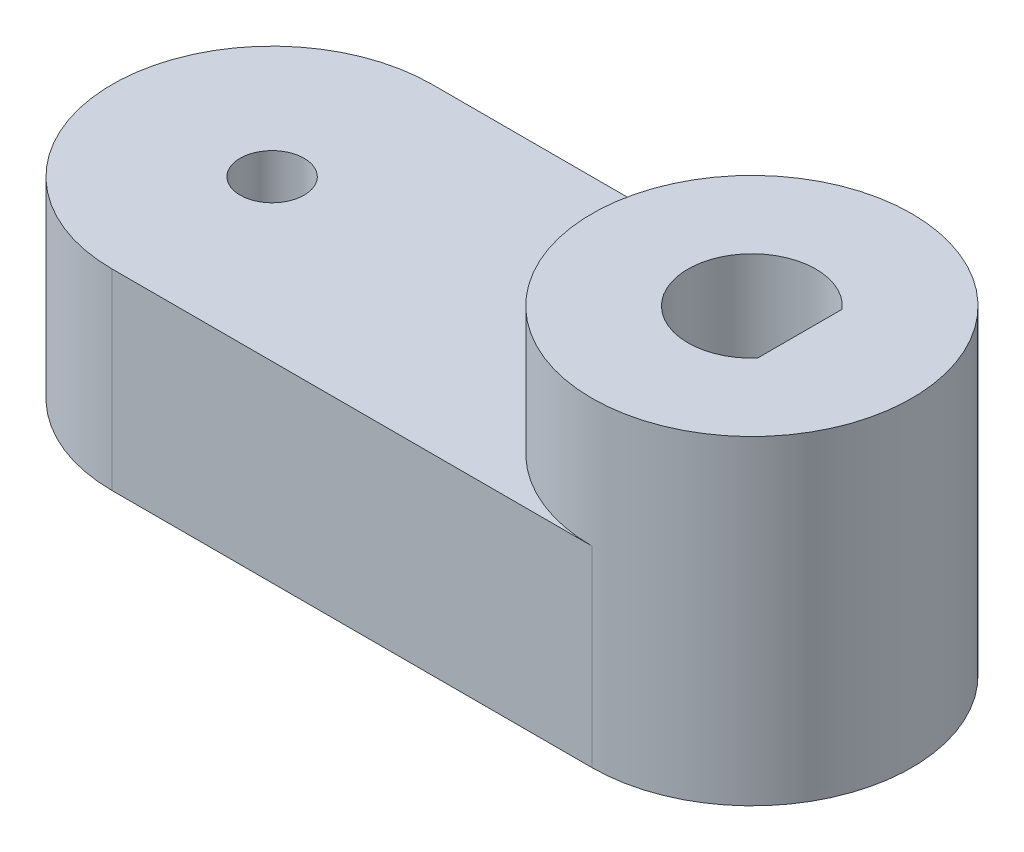
ISO-10303-21;
HEADER;
FILE_DESCRIPTION(('STEP AP214'),'2;1');
FILE_NAME('part.step','',(''),(''),'','','');
FILE_SCHEMA(('AUTOMOTIVE_DESIGN { 1 0 10303 214 1 1 1 1 }'));
ENDSEC;
DATA;
#1=APPLICATION_CONTEXT('core data for automotive mechanical design processes');
#2=APPLICATION_PROTOCOL_DEFINITION('international standard','automotive_design',2000,#1);
#3=PRODUCT_CONTEXT('',#1,'mechanical');
#4=PRODUCT('Part','Part','',(#3));
#5=PRODUCT_RELATED_PRODUCT_CATEGORY('part','',(#4));
#6=PRODUCT_DEFINITION_FORMATION('','',#4);
#7=PRODUCT_DEFINITION_CONTEXT('part definition',#1,'design');
#8=PRODUCT_DEFINITION('design','',#6,#7);
#9=PRODUCT_DEFINITION_SHAPE('','',#8);
#10=(LENGTH_UNIT() NAMED_UNIT(*) SI_UNIT(.MILLI.,.METRE.));
#11=(NAMED_UNIT(*) PLANE_ANGLE_UNIT() SI_UNIT($,.RADIAN.));
#12=(NAMED_UNIT(*) SI_UNIT($,.STERADIAN.) SOLID_ANGLE_UNIT());
#13=UNCERTAINTY_MEASURE_WITH_UNIT(LENGTH_MEASURE(1.E-05),#10,'distance_accuracy_value','');
#14=(GEOMETRIC_REPRESENTATION_CONTEXT(3) GLOBAL_UNCERTAINTY_ASSIGNED_CONTEXT((#13)) GLOBAL_UNIT_ASSIGNED_CONTEXT((#10,
#11,#12)) REPRESENTATION_CONTEXT('',''));
#15=CARTESIAN_POINT('',(0.,0.,0.));
#16=DIRECTION('',(0.,0.,1.));
#17=DIRECTION('',(1.,0.,0.));
#18=AXIS2_PLACEMENT_3D('',#15,#16,#17);
#19=CARTESIAN_POINT('',(0.,6.,0.));
#20=DIRECTION('',(0.,1.,0.));
#21=DIRECTION('',(0.,0.,1.));
#22=AXIS2_PLACEMENT_3D('',#19,#20,#21);
#23=PLANE('',#22);
#24=CARTESIAN_POINT('',(15.,6.,0.));
#25=DIRECTION('',(0.,1.,0.));
#26=DIRECTION('',(0.,0.,1.));
#27=AXIS2_PLACEMENT_3D('',#24,#25,#26);
#28=CIRCLE('',#27,5.00000000000002);
#29=CARTESIAN_POINT('',(15.,6.,-5.));
#30=VERTEX_POINT('',#29);
#31=CARTESIAN_POINT('',(15.,6.,5.00000000000006));
#32=VERTEX_POINT('',#31);
#33=EDGE_CURVE('E11',#30,#32,#28,.T.);
#34=ORIENTED_EDGE('',*,*,#33,.F.);
#35=DIRECTION('',(-1.,0.,0.));
#36=VECTOR('',#35,1.);
#37=CARTESIAN_POINT('',(0.,6.,-5.));
#38=LINE('',#37,#36);
#39=CARTESIAN_POINT('',(0.,6.,-5.));
#40=VERTEX_POINT('',#39);
#41=EDGE_CURVE('E121',#30,#40,#38,.T.);
#42=ORIENTED_EDGE('',*,*,#41,.T.);
#43=CARTESIAN_POINT('',(0.,6.,0.));
#44=DIRECTION('',(0.,1.,0.));
#45=DIRECTION('',(0.,0.,1.));
#46=AXIS2_PLACEMENT_3D('',#43,#44,#45);
#47=CIRCLE('',#46,5.);
#48=CARTESIAN_POINT('',(0.,6.,5.));
#49=VERTEX_POINT('',#48);
#50=EDGE_CURVE('E114',#40,#49,#47,.T.);
#51=ORIENTED_EDGE('',*,*,#50,.T.);
#52=DIRECTION('',(1.,0.,0.));
#53=VECTOR('',#52,1.);
#54=CARTESIAN_POINT('',(0.,6.,5.));
#55=LINE('',#54,#53);
#56=EDGE_CURVE('E117',#49,#32,#55,.T.);
#57=ORIENTED_EDGE('',*,*,#56,.T.);
#58=EDGE_LOOP('',(#34,#42,#51,#57));
#59=FACE_BOUND('',#58,.T.);
#60=CARTESIAN_POINT('',(0.,6.,0.));
#61=DIRECTION('',(0.,1.,0.));
#62=DIRECTION('',(0.,0.,1.));
#63=AXIS2_PLACEMENT_3D('',#60,#61,#62);
#64=CIRCLE('',#63,1.);
#65=CARTESIAN_POINT('',(0.,6.,1.));
#66=VERTEX_POINT('',#65);
#67=EDGE_CURVE('E108',#66,#66,#64,.T.);
#68=ORIENTED_EDGE('',*,*,#67,.F.);
#69=EDGE_LOOP('',(#68));
#70=FACE_BOUND('',#69,.T.);
#71=ADVANCED_FACE('F33',(#59,#70),#23,.T.);
#72=CARTESIAN_POINT('',(0.,0.,0.));
#73=DIRECTION('',(0.,1.,0.));
#74=DIRECTION('',(0.,0.,1.));
#75=AXIS2_PLACEMENT_3D('',#72,#73,#74);
#76=PLANE('',#75);
#77=DIRECTION('',(0.,0.,-1.));
#78=VECTOR('',#77,1.);
#79=CARTESIAN_POINT('',(16.5,0.,1.32287565553233));
#80=LINE('',#79,#78);
#81=CARTESIAN_POINT('',(16.5,0.,1.32287565553233));
#82=VERTEX_POINT('',#81);
#83=CARTESIAN_POINT('',(16.5,0.,-1.32287565553233));
#84=VERTEX_POINT('',#83);
#85=EDGE_CURVE('E90',#82,#84,#80,.T.);
#86=ORIENTED_EDGE('',*,*,#85,.T.);
#87=CARTESIAN_POINT('',(15.,0.,0.));
#88=DIRECTION('',(0.,1.,0.));
#89=DIRECTION('',(0.,0.,1.));
#90=AXIS2_PLACEMENT_3D('',#87,#88,#89);
#91=CIRCLE('',#90,2.00000000000003);
#92=EDGE_CURVE('E49',#84,#82,#91,.T.);
#93=ORIENTED_EDGE('',*,*,#92,.T.);
#94=EDGE_LOOP('',(#86,#93));
#95=FACE_BOUND('',#94,.T.);
#96=CARTESIAN_POINT('',(0.,0.,0.));
#97=DIRECTION('',(0.,1.,0.));
#98=DIRECTION('',(0.,0.,1.));
#99=AXIS2_PLACEMENT_3D('',#96,#97,#98);
#100=CIRCLE('',#99,5.);
#101=CARTESIAN_POINT('',(0.,0.,-5.));
#102=VERTEX_POINT('',#101);
#103=CARTESIAN_POINT('',(0.,0.,5.));
#104=VERTEX_POINT('',#103);
#105=EDGE_CURVE('E111',#102,#104,#100,.T.);
#106=ORIENTED_EDGE('',*,*,#105,.F.);
#107=DIRECTION('',(-1.,0.,0.));
#108=VECTOR('',#107,1.);
#109=CARTESIAN_POINT('',(0.,0.,-5.));
#110=LINE('',#109,#108);
#111=CARTESIAN_POINT('',(15.,0.,-5.));
#112=VERTEX_POINT('',#111);
#113=EDGE_CURVE('E118',#112,#102,#110,.T.);
#114=ORIENTED_EDGE('',*,*,#113,.F.);
#115=CARTESIAN_POINT('',(15.,0.,0.));
#116=DIRECTION('',(0.,1.,0.));
#117=DIRECTION('',(0.,0.,-1.));
#118=AXIS2_PLACEMENT_3D('',#115,#116,#117);
#119=CIRCLE('',#118,5.);
#120=CARTESIAN_POINT('',(15.,0.,5.00000000000004));
#121=VERTEX_POINT('',#120);
#122=EDGE_CURVE('E128',#121,#112,#119,.T.);
#123=ORIENTED_EDGE('',*,*,#122,.F.);
#124=DIRECTION('',(1.,0.,0.));
#125=VECTOR('',#124,1.);
#126=CARTESIAN_POINT('',(0.,0.,5.));
#127=LINE('',#126,#125);
#128=EDGE_CURVE('E126',#104,#121,#127,.T.);
#129=ORIENTED_EDGE('',*,*,#128,.F.);
#130=EDGE_LOOP('',(#106,#114,#123,#129));
#131=FACE_BOUND('',#130,.T.);
#132=CARTESIAN_POINT('',(0.,0.,0.));
#133=DIRECTION('',(0.,1.,0.));
#134=DIRECTION('',(0.,0.,1.));
#135=AXIS2_PLACEMENT_3D('',#132,#133,#134);
#136=CIRCLE('',#135,1.);
#137=CARTESIAN_POINT('',(0.,0.,1.));
#138=VERTEX_POINT('',#137);
#139=EDGE_CURVE('E106',#138,#138,#136,.T.);
#140=ORIENTED_EDGE('',*,*,#139,.T.);
#141=EDGE_LOOP('',(#140));
#142=FACE_BOUND('',#141,.T.);
#143=ADVANCED_FACE('F96',(#95,#131,#142),#76,.F.);
#144=CARTESIAN_POINT('',(0.,6.,0.));
#145=DIRECTION('',(0.,-1.,0.));
#146=DIRECTION('',(0.,0.,-1.));
#147=AXIS2_PLACEMENT_3D('',#144,#145,#146);
#148=CYLINDRICAL_SURFACE('',#147,5.);
#149=ORIENTED_EDGE('',*,*,#105,.T.);
#150=DIRECTION('',(0.,-1.,0.));
#151=VECTOR('',#150,1.);
#152=CARTESIAN_POINT('',(0.,6.,5.));
#153=LINE('',#152,#151);
#154=EDGE_CURVE('E37',#49,#104,#153,.T.);
#155=ORIENTED_EDGE('',*,*,#154,.F.);
#156=ORIENTED_EDGE('',*,*,#50,.F.);
#157=DIRECTION('',(0.,-1.,0.));
#158=VECTOR('',#157,1.);
#159=CARTESIAN_POINT('',(0.,6.,-5.));
#160=LINE('',#159,#158);
#161=EDGE_CURVE('E123',#40,#102,#160,.T.);
#162=ORIENTED_EDGE('',*,*,#161,.T.);
#163=EDGE_LOOP('',(#149,#155,#156,#162));
#164=FACE_BOUND('',#163,.T.);
#165=ADVANCED_FACE('F35',(#164),#148,.T.);
#166=CARTESIAN_POINT('',(0.,6.,5.));
#167=DIRECTION('',(0.,0.,-1.));
#168=DIRECTION('',(-1.,0.,0.));
#169=AXIS2_PLACEMENT_3D('',#166,#167,#168);
#170=PLANE('',#169);
#171=ORIENTED_EDGE('',*,*,#128,.T.);
#172=DIRECTION('',(0.,-1.,0.));
#173=VECTOR('',#172,1.);
#174=CARTESIAN_POINT('',(15.,6.,5.00000000000004));
#175=LINE('',#174,#173);
#176=EDGE_CURVE('E135',#32,#121,#175,.T.);
#177=ORIENTED_EDGE('',*,*,#176,.F.);
#178=ORIENTED_EDGE('',*,*,#56,.F.);
#179=ORIENTED_EDGE('',*,*,#154,.T.);
#180=EDGE_LOOP('',(#171,#177,#178,#179));
#181=FACE_BOUND('',#180,.T.);
#182=ADVANCED_FACE('F142',(#181),#170,.F.);
#183=CARTESIAN_POINT('',(15.,6.,0.));
#184=DIRECTION('',(0.,-1.,0.));
#185=DIRECTION('',(0.,0.,-1.));
#186=AXIS2_PLACEMENT_3D('',#183,#184,#185);
#187=CYLINDRICAL_SURFACE('',#186,5.);
#188=ORIENTED_EDGE('',*,*,#122,.T.);
#189=DIRECTION('',(0.,-1.,0.));
#190=VECTOR('',#189,1.);
#191=CARTESIAN_POINT('',(15.,6.,-5.));
#192=LINE('',#191,#190);
#193=EDGE_CURVE('E133',#30,#112,#192,.T.);
#194=ORIENTED_EDGE('',*,*,#193,.F.);
#195=ORIENTED_EDGE('',*,*,#33,.T.);
#196=ORIENTED_EDGE('',*,*,#176,.T.);
#197=EDGE_LOOP('',(#188,#194,#195,#196));
#198=FACE_BOUND('',#197,.T.);
#199=CARTESIAN_POINT('',(15.,10.,0.));
#200=DIRECTION('',(0.,1.,0.));
#201=DIRECTION('',(0.,0.,1.));
#202=AXIS2_PLACEMENT_3D('',#199,#200,#201);
#203=CIRCLE('',#202,5.00000000000002);
#204=CARTESIAN_POINT('',(15.,10.,5.00000000000006));
#205=VERTEX_POINT('',#204);
#206=EDGE_CURVE('E103',#205,#205,#203,.T.);
#207=ORIENTED_EDGE('',*,*,#206,.F.);
#208=EDGE_LOOP('',(#207));
#209=FACE_BOUND('',#208,.T.);
#210=ADVANCED_FACE('F150',(#198,#209),#187,.T.);
#211=CARTESIAN_POINT('',(0.,6.,-5.));
#212=DIRECTION('',(0.,0.,1.));
#213=DIRECTION('',(1.,0.,0.));
#214=AXIS2_PLACEMENT_3D('',#211,#212,#213);
#215=PLANE('',#214);
#216=ORIENTED_EDGE('',*,*,#113,.T.);
#217=ORIENTED_EDGE('',*,*,#161,.F.);
#218=ORIENTED_EDGE('',*,*,#41,.F.);
#219=ORIENTED_EDGE('',*,*,#193,.T.);
#220=EDGE_LOOP('',(#216,#217,#218,#219));
#221=FACE_BOUND('',#220,.T.);
#222=ADVANCED_FACE('F154',(#221),#215,.F.);
#223=CARTESIAN_POINT('',(0.,6.,0.));
#224=DIRECTION('',(0.,-1.,0.));
#225=DIRECTION('',(0.,0.,-1.));
#226=AXIS2_PLACEMENT_3D('',#223,#224,#225);
#227=CYLINDRICAL_SURFACE('',#226,1.);
#228=ORIENTED_EDGE('',*,*,#67,.T.);
#229=EDGE_LOOP('',(#228));
#230=FACE_BOUND('',#229,.T.);
#231=ORIENTED_EDGE('',*,*,#139,.F.);
#232=EDGE_LOOP('',(#231));
#233=FACE_BOUND('',#232,.T.);
#234=ADVANCED_FACE('F161',(#230,#233),#227,.F.);
#235=CARTESIAN_POINT('',(15.,10.,0.));
#236=DIRECTION('',(0.,1.,0.));
#237=DIRECTION('',(0.,0.,1.));
#238=AXIS2_PLACEMENT_3D('',#235,#236,#237);
#239=PLANE('',#238);
#240=CARTESIAN_POINT('',(15.,10.,0.));
#241=DIRECTION('',(0.,1.,0.));
#242=DIRECTION('',(0.,0.,1.));
#243=AXIS2_PLACEMENT_3D('',#240,#241,#242);
#244=CIRCLE('',#243,2.00000000000003);
#245=CARTESIAN_POINT('',(16.5,10.,-1.32287565553233));
#246=VERTEX_POINT('',#245);
#247=CARTESIAN_POINT('',(16.5,10.,1.32287565553233));
#248=VERTEX_POINT('',#247);
#249=EDGE_CURVE('E54',#246,#248,#244,.T.);
#250=ORIENTED_EDGE('',*,*,#249,.F.);
#251=DIRECTION('',(0.,0.,-1.));
#252=VECTOR('',#251,1.);
#253=CARTESIAN_POINT('',(16.5,10.,1.32287565553233));
#254=LINE('',#253,#252);
#255=EDGE_CURVE('E98',#248,#246,#254,.T.);
#256=ORIENTED_EDGE('',*,*,#255,.F.);
#257=EDGE_LOOP('',(#250,#256));
#258=FACE_BOUND('',#257,.T.);
#259=ORIENTED_EDGE('',*,*,#206,.T.);
#260=EDGE_LOOP('',(#259));
#261=FACE_BOUND('',#260,.T.);
#262=ADVANCED_FACE('F164',(#258,#261),#239,.T.);
#263=CARTESIAN_POINT('',(15.,0.,0.));
#264=DIRECTION('',(0.,1.,0.));
#265=DIRECTION('',(0.,0.,1.));
#266=AXIS2_PLACEMENT_3D('',#263,#264,#265);
#267=CYLINDRICAL_SURFACE('',#266,2.00000000000003);
#268=ORIENTED_EDGE('',*,*,#249,.T.);
#269=DIRECTION('',(0.,1.,0.));
#270=VECTOR('',#269,1.);
#271=CARTESIAN_POINT('',(16.5,0.,1.32287565553233));
#272=LINE('',#271,#270);
#273=EDGE_CURVE('E83',#82,#248,#272,.T.);
#274=ORIENTED_EDGE('',*,*,#273,.F.);
#275=ORIENTED_EDGE('',*,*,#92,.F.);
#276=DIRECTION('',(0.,1.,0.));
#277=VECTOR('',#276,1.);
#278=CARTESIAN_POINT('',(16.5,0.,-1.32287565553233));
#279=LINE('',#278,#277);
#280=EDGE_CURVE('E89',#84,#246,#279,.T.);
#281=ORIENTED_EDGE('',*,*,#280,.T.);
#282=EDGE_LOOP('',(#268,#274,#275,#281));
#283=FACE_BOUND('',#282,.T.);
#284=ADVANCED_FACE('F85',(#283),#267,.F.);
#285=CARTESIAN_POINT('',(16.5,0.,1.32287565553233));
#286=DIRECTION('',(1.,0.,0.));
#287=DIRECTION('',(0.,0.,-1.));
#288=AXIS2_PLACEMENT_3D('',#285,#286,#287);
#289=PLANE('',#288);
#290=ORIENTED_EDGE('',*,*,#255,.T.);
#291=ORIENTED_EDGE('',*,*,#280,.F.);
#292=ORIENTED_EDGE('',*,*,#85,.F.);
#293=ORIENTED_EDGE('',*,*,#273,.T.);
#294=EDGE_LOOP('',(#290,#291,#292,#293));
#295=FACE_BOUND('',#294,.T.);
#296=ADVANCED_FACE('F93',(#295),#289,.F.);
#297=CLOSED_SHELL('',(#71,#143,#165,#182,#210,#222,#234,#262,#284,#296));
#298=MANIFOLD_SOLID_BREP('B2',#297);
#299=ADVANCED_BREP_SHAPE_REPRESENTATION('',(#18,#298),#14);
#300=SHAPE_DEFINITION_REPRESENTATION(#9,#299);
ENDSEC;
END-ISO-10303-21;
